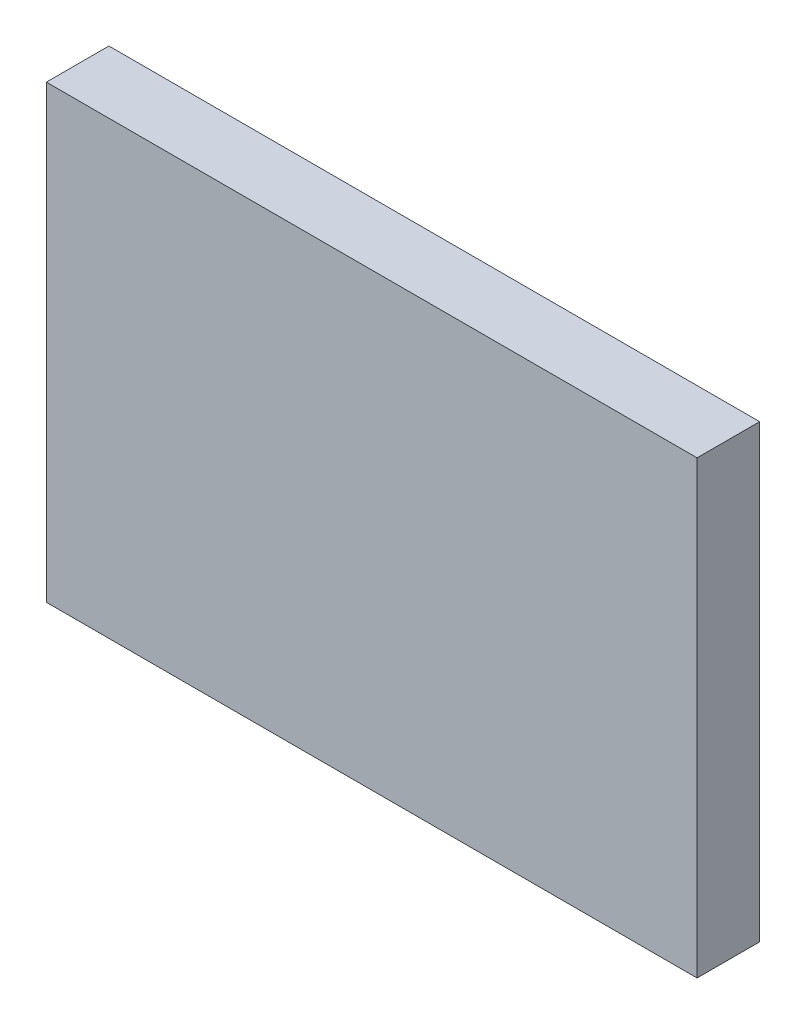
ISO-10303-21;
HEADER;
FILE_DESCRIPTION(('STEP AP214'),'2;1');
FILE_NAME('part.step','',(''),(''),'','','');
FILE_SCHEMA(('AUTOMOTIVE_DESIGN { 1 0 10303 214 1 1 1 1 }'));
ENDSEC;
DATA;
#1=APPLICATION_CONTEXT('core data for automotive mechanical design processes');
#2=APPLICATION_PROTOCOL_DEFINITION('international standard','automotive_design',2000,#1);
#3=PRODUCT_CONTEXT('',#1,'mechanical');
#4=PRODUCT('Part','Part','',(#3));
#5=PRODUCT_RELATED_PRODUCT_CATEGORY('part','',(#4));
#6=PRODUCT_DEFINITION_FORMATION('','',#4);
#7=PRODUCT_DEFINITION_CONTEXT('part definition',#1,'design');
#8=PRODUCT_DEFINITION('design','',#6,#7);
#9=PRODUCT_DEFINITION_SHAPE('','',#8);
#10=(LENGTH_UNIT() NAMED_UNIT(*) SI_UNIT(.MILLI.,.METRE.));
#11=(NAMED_UNIT(*) PLANE_ANGLE_UNIT() SI_UNIT($,.RADIAN.));
#12=(NAMED_UNIT(*) SI_UNIT($,.STERADIAN.) SOLID_ANGLE_UNIT());
#13=UNCERTAINTY_MEASURE_WITH_UNIT(LENGTH_MEASURE(1.E-05),#10,'distance_accuracy_value','');
#14=(GEOMETRIC_REPRESENTATION_CONTEXT(3) GLOBAL_UNCERTAINTY_ASSIGNED_CONTEXT((#13)) GLOBAL_UNIT_ASSIGNED_CONTEXT((#10,
#11,#12)) REPRESENTATION_CONTEXT('',''));
#15=CARTESIAN_POINT('',(0.,0.,0.));
#16=DIRECTION('',(0.,0.,1.));
#17=DIRECTION('',(1.,0.,0.));
#18=AXIS2_PLACEMENT_3D('',#15,#16,#17);
#19=CARTESIAN_POINT('',(0.,18.,0.));
#20=DIRECTION('',(1.,0.,0.));
#21=DIRECTION('',(0.,0.,-1.));
#22=AXIS2_PLACEMENT_3D('',#19,#20,#21);
#23=PLANE('',#22);
#24=DIRECTION('',(0.,0.,1.));
#25=VECTOR('',#24,1.);
#26=CARTESIAN_POINT('',(0.,0.,0.));
#27=LINE('',#26,#25);
#28=CARTESIAN_POINT('',(0.,0.,-2.5));
#29=VERTEX_POINT('',#28);
#30=CARTESIAN_POINT('',(0.,0.,0.));
#31=VERTEX_POINT('',#30);
#32=EDGE_CURVE('E96',#29,#31,#27,.T.);
#33=ORIENTED_EDGE('',*,*,#32,.T.);
#34=DIRECTION('',(0.,-1.,0.));
#35=VECTOR('',#34,1.);
#36=CARTESIAN_POINT('',(0.,18.,0.));
#37=LINE('',#36,#35);
#38=CARTESIAN_POINT('',(0.,18.,0.));
#39=VERTEX_POINT('',#38);
#40=EDGE_CURVE('E11',#39,#31,#37,.T.);
#41=ORIENTED_EDGE('',*,*,#40,.F.);
#42=DIRECTION('',(0.,0.,1.));
#43=VECTOR('',#42,1.);
#44=CARTESIAN_POINT('',(0.,18.,0.));
#45=LINE('',#44,#43);
#46=CARTESIAN_POINT('',(0.,18.,-2.5));
#47=VERTEX_POINT('',#46);
#48=EDGE_CURVE('E84',#47,#39,#45,.T.);
#49=ORIENTED_EDGE('',*,*,#48,.F.);
#50=DIRECTION('',(0.,-1.,0.));
#51=VECTOR('',#50,1.);
#52=CARTESIAN_POINT('',(0.,18.,-2.5));
#53=LINE('',#52,#51);
#54=EDGE_CURVE('E92',#47,#29,#53,.T.);
#55=ORIENTED_EDGE('',*,*,#54,.T.);
#56=EDGE_LOOP('',(#33,#41,#49,#55));
#57=FACE_BOUND('',#56,.T.);
#58=ADVANCED_FACE('F33',(#57),#23,.F.);
#59=CARTESIAN_POINT('',(0.,18.,0.));
#60=DIRECTION('',(0.,0.,-1.));
#61=DIRECTION('',(-1.,0.,0.));
#62=AXIS2_PLACEMENT_3D('',#59,#60,#61);
#63=PLANE('',#62);
#64=DIRECTION('',(1.,0.,0.));
#65=VECTOR('',#64,1.);
#66=CARTESIAN_POINT('',(0.,0.,0.));
#67=LINE('',#66,#65);
#68=CARTESIAN_POINT('',(26.,0.,0.));
#69=VERTEX_POINT('',#68);
#70=EDGE_CURVE('E88',#31,#69,#67,.T.);
#71=ORIENTED_EDGE('',*,*,#70,.T.);
#72=DIRECTION('',(0.,-1.,0.));
#73=VECTOR('',#72,1.);
#74=CARTESIAN_POINT('',(26.,18.,0.));
#75=LINE('',#74,#73);
#76=CARTESIAN_POINT('',(26.,18.,0.));
#77=VERTEX_POINT('',#76);
#78=EDGE_CURVE('E41',#77,#69,#75,.T.);
#79=ORIENTED_EDGE('',*,*,#78,.F.);
#80=DIRECTION('',(1.,0.,0.));
#81=VECTOR('',#80,1.);
#82=CARTESIAN_POINT('',(0.,18.,0.));
#83=LINE('',#82,#81);
#84=EDGE_CURVE('E79',#39,#77,#83,.T.);
#85=ORIENTED_EDGE('',*,*,#84,.F.);
#86=ORIENTED_EDGE('',*,*,#40,.T.);
#87=EDGE_LOOP('',(#71,#79,#85,#86));
#88=FACE_BOUND('',#87,.T.);
#89=ADVANCED_FACE('F87',(#88),#63,.F.);
#90=CARTESIAN_POINT('',(26.,18.,0.));
#91=DIRECTION('',(-1.,0.,0.));
#92=DIRECTION('',(0.,0.,1.));
#93=AXIS2_PLACEMENT_3D('',#90,#91,#92);
#94=PLANE('',#93);
#95=DIRECTION('',(0.,0.,-1.));
#96=VECTOR('',#95,1.);
#97=CARTESIAN_POINT('',(26.,0.,0.));
#98=LINE('',#97,#96);
#99=CARTESIAN_POINT('',(26.,0.,-2.5));
#100=VERTEX_POINT('',#99);
#101=EDGE_CURVE('E66',#69,#100,#98,.T.);
#102=ORIENTED_EDGE('',*,*,#101,.T.);
#103=DIRECTION('',(0.,-1.,0.));
#104=VECTOR('',#103,1.);
#105=CARTESIAN_POINT('',(26.,18.,-2.5));
#106=LINE('',#105,#104);
#107=CARTESIAN_POINT('',(26.,18.,-2.5));
#108=VERTEX_POINT('',#107);
#109=EDGE_CURVE('E89',#108,#100,#106,.T.);
#110=ORIENTED_EDGE('',*,*,#109,.F.);
#111=DIRECTION('',(0.,0.,-1.));
#112=VECTOR('',#111,1.);
#113=CARTESIAN_POINT('',(26.,18.,0.));
#114=LINE('',#113,#112);
#115=EDGE_CURVE('E82',#77,#108,#114,.T.);
#116=ORIENTED_EDGE('',*,*,#115,.F.);
#117=ORIENTED_EDGE('',*,*,#78,.T.);
#118=EDGE_LOOP('',(#102,#110,#116,#117));
#119=FACE_BOUND('',#118,.T.);
#120=ADVANCED_FACE('F90',(#119),#94,.F.);
#121=CARTESIAN_POINT('',(0.,18.,-2.5));
#122=DIRECTION('',(0.,0.,1.));
#123=DIRECTION('',(1.,0.,0.));
#124=AXIS2_PLACEMENT_3D('',#121,#122,#123);
#125=PLANE('',#124);
#126=DIRECTION('',(-1.,0.,0.));
#127=VECTOR('',#126,1.);
#128=CARTESIAN_POINT('',(0.,0.,-2.5));
#129=LINE('',#128,#127);
#130=EDGE_CURVE('E72',#100,#29,#129,.T.);
#131=ORIENTED_EDGE('',*,*,#130,.T.);
#132=ORIENTED_EDGE('',*,*,#54,.F.);
#133=DIRECTION('',(-1.,0.,0.));
#134=VECTOR('',#133,1.);
#135=CARTESIAN_POINT('',(0.,18.,-2.5));
#136=LINE('',#135,#134);
#137=EDGE_CURVE('E49',#108,#47,#136,.T.);
#138=ORIENTED_EDGE('',*,*,#137,.F.);
#139=ORIENTED_EDGE('',*,*,#109,.T.);
#140=EDGE_LOOP('',(#131,#132,#138,#139));
#141=FACE_BOUND('',#140,.T.);
#142=ADVANCED_FACE('F103',(#141),#125,.F.);
#143=CARTESIAN_POINT('',(0.,18.,0.));
#144=DIRECTION('',(0.,-1.,0.));
#145=DIRECTION('',(0.,0.,-1.));
#146=AXIS2_PLACEMENT_3D('',#143,#144,#145);
#147=PLANE('',#146);
#148=ORIENTED_EDGE('',*,*,#48,.T.);
#149=ORIENTED_EDGE('',*,*,#84,.T.);
#150=ORIENTED_EDGE('',*,*,#115,.T.);
#151=ORIENTED_EDGE('',*,*,#137,.T.);
#152=EDGE_LOOP('',(#148,#149,#150,#151));
#153=FACE_BOUND('',#152,.T.);
#154=ADVANCED_FACE('F80',(#153),#147,.F.);
#155=CARTESIAN_POINT('',(0.,0.,0.));
#156=DIRECTION('',(0.,-1.,0.));
#157=DIRECTION('',(0.,0.,-1.));
#158=AXIS2_PLACEMENT_3D('',#155,#156,#157);
#159=PLANE('',#158);
#160=ORIENTED_EDGE('',*,*,#32,.F.);
#161=ORIENTED_EDGE('',*,*,#130,.F.);
#162=ORIENTED_EDGE('',*,*,#101,.F.);
#163=ORIENTED_EDGE('',*,*,#70,.F.);
#164=EDGE_LOOP('',(#160,#161,#162,#163));
#165=FACE_BOUND('',#164,.T.);
#166=ADVANCED_FACE('F106',(#165),#159,.T.);
#167=CLOSED_SHELL('',(#58,#89,#120,#142,#154,#166));
#168=MANIFOLD_SOLID_BREP('B2',#167);
#169=ADVANCED_BREP_SHAPE_REPRESENTATION('',(#18,#168),#14);
#170=SHAPE_DEFINITION_REPRESENTATION(#9,#169);
ENDSEC;
END-ISO-10303-21;
